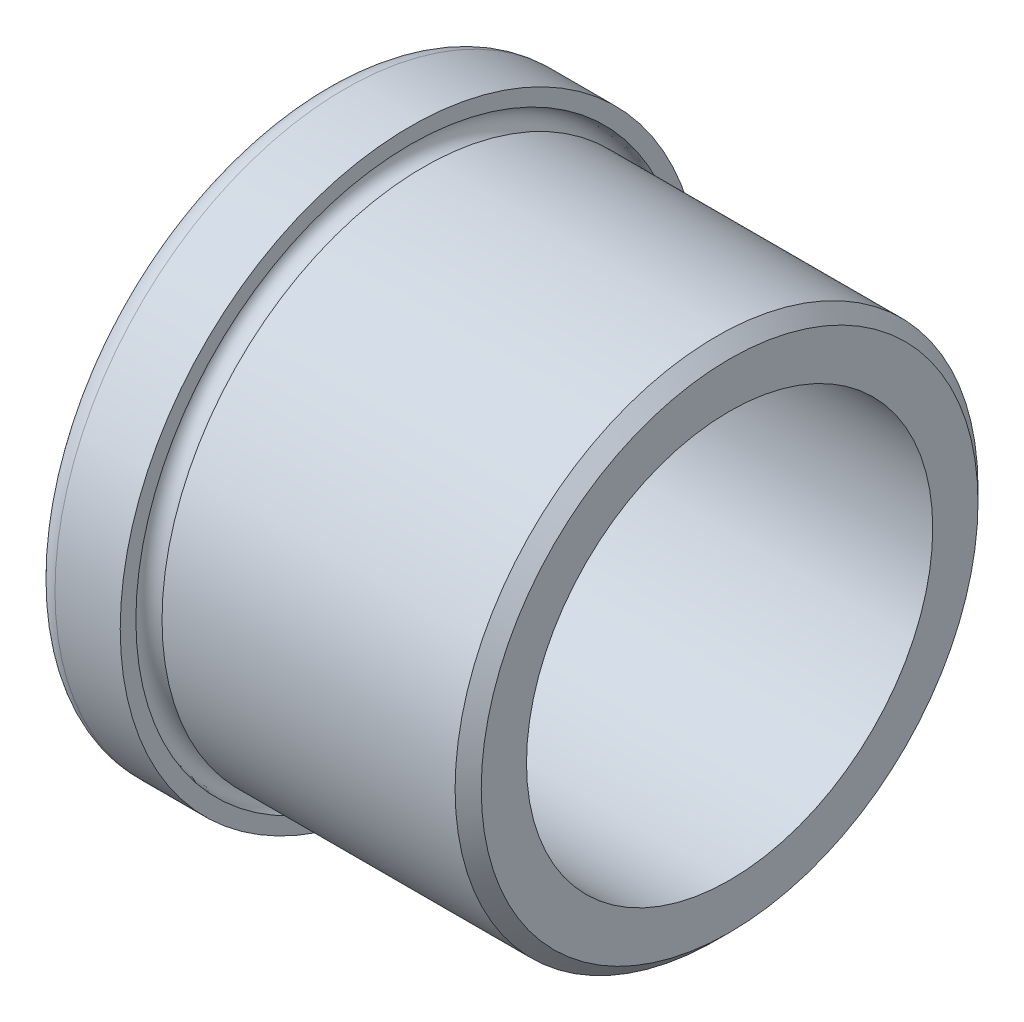
ISO-10303-21;
HEADER;
FILE_DESCRIPTION(('STEP AP214'),'2;1');
FILE_NAME('part.step','',(''),(''),'','','');
FILE_SCHEMA(('AUTOMOTIVE_DESIGN { 1 0 10303 214 1 1 1 1 }'));
ENDSEC;
DATA;
#1=APPLICATION_CONTEXT('core data for automotive mechanical design processes');
#2=APPLICATION_PROTOCOL_DEFINITION('international standard','automotive_design',2000,#1);
#3=PRODUCT_CONTEXT('',#1,'mechanical');
#4=PRODUCT('Part','Part','',(#3));
#5=PRODUCT_RELATED_PRODUCT_CATEGORY('part','',(#4));
#6=PRODUCT_DEFINITION_FORMATION('','',#4);
#7=PRODUCT_DEFINITION_CONTEXT('part definition',#1,'design');
#8=PRODUCT_DEFINITION('design','',#6,#7);
#9=PRODUCT_DEFINITION_SHAPE('','',#8);
#10=(LENGTH_UNIT() NAMED_UNIT(*) SI_UNIT(.MILLI.,.METRE.));
#11=(NAMED_UNIT(*) PLANE_ANGLE_UNIT() SI_UNIT($,.RADIAN.));
#12=(NAMED_UNIT(*) SI_UNIT($,.STERADIAN.) SOLID_ANGLE_UNIT());
#13=UNCERTAINTY_MEASURE_WITH_UNIT(LENGTH_MEASURE(1.E-05),#10,'distance_accuracy_value','');
#14=(GEOMETRIC_REPRESENTATION_CONTEXT(3) GLOBAL_UNCERTAINTY_ASSIGNED_CONTEXT((#13)) GLOBAL_UNIT_ASSIGNED_CONTEXT((#10,
#11,#12)) REPRESENTATION_CONTEXT('',''));
#15=CARTESIAN_POINT('',(0.,0.,0.));
#16=DIRECTION('',(0.,0.,1.));
#17=DIRECTION('',(1.,0.,0.));
#18=AXIS2_PLACEMENT_3D('',#15,#16,#17);
#19=CARTESIAN_POINT('',(9.52499999999999,31.75,0.));
#20=DIRECTION('',(1.,0.,0.));
#21=DIRECTION('',(0.,0.,-1.));
#22=AXIS2_PLACEMENT_3D('',#19,#20,#21);
#23=PLANE('',#22);
#24=CARTESIAN_POINT('',(9.52499999999999,0.,0.));
#25=DIRECTION('',(-1.,0.,0.));
#26=DIRECTION('',(0.,0.,1.));
#27=AXIS2_PLACEMENT_3D('',#24,#25,#26);
#28=CIRCLE('',#27,30.0370875);
#29=CARTESIAN_POINT('',(9.52499999999999,0.,30.0370875));
#30=VERTEX_POINT('',#29);
#31=EDGE_CURVE('E64',#30,#30,#28,.T.);
#32=ORIENTED_EDGE('',*,*,#31,.T.);
#33=EDGE_LOOP('',(#32));
#34=FACE_BOUND('',#33,.T.);
#35=CARTESIAN_POINT('',(9.52499999999999,0.,0.));
#36=DIRECTION('',(-1.,0.,0.));
#37=DIRECTION('',(0.,0.,1.));
#38=AXIS2_PLACEMENT_3D('',#35,#36,#37);
#39=CIRCLE('',#38,31.75);
#40=CARTESIAN_POINT('',(9.52499999999999,0.,31.75));
#41=VERTEX_POINT('',#40);
#42=EDGE_CURVE('E10',#41,#41,#39,.T.);
#43=ORIENTED_EDGE('',*,*,#42,.F.);
#44=EDGE_LOOP('',(#43));
#45=FACE_BOUND('',#44,.T.);
#46=ADVANCED_FACE('F30',(#34,#45),#23,.T.);
#47=CARTESIAN_POINT('',(0.,0.,0.));
#48=DIRECTION('',(-1.,0.,0.));
#49=DIRECTION('',(0.,0.,1.));
#50=AXIS2_PLACEMENT_3D('',#47,#48,#49);
#51=CYLINDRICAL_SURFACE('',#50,31.75);
#52=ORIENTED_EDGE('',*,*,#42,.T.);
#53=EDGE_LOOP('',(#52));
#54=FACE_BOUND('',#53,.T.);
#55=CARTESIAN_POINT('',(2.3876,0.,0.));
#56=DIRECTION('',(-1.,0.,0.));
#57=DIRECTION('',(0.,0.,1.));
#58=AXIS2_PLACEMENT_3D('',#55,#56,#57);
#59=CIRCLE('',#58,31.75);
#60=CARTESIAN_POINT('',(2.3876,0.,31.75));
#61=VERTEX_POINT('',#60);
#62=EDGE_CURVE('E36',#61,#61,#59,.T.);
#63=ORIENTED_EDGE('',*,*,#62,.F.);
#64=EDGE_LOOP('',(#63));
#65=FACE_BOUND('',#64,.T.);
#66=ADVANCED_FACE('F82',(#54,#65),#51,.T.);
#67=CARTESIAN_POINT('',(2.3876,0.,0.));
#68=DIRECTION('',(-1.,0.,0.));
#69=DIRECTION('',(0.,0.,1.));
#70=AXIS2_PLACEMENT_3D('',#67,#68,#69);
#71=TOROIDAL_SURFACE('',#70,29.3624,2.3876);
#72=CARTESIAN_POINT('',(0.,0.,0.));
#73=DIRECTION('',(-1.,0.,0.));
#74=DIRECTION('',(0.,0.,1.));
#75=AXIS2_PLACEMENT_3D('',#72,#73,#74);
#76=CIRCLE('',#75,29.3624);
#77=CARTESIAN_POINT('',(0.,0.,29.3624));
#78=VERTEX_POINT('',#77);
#79=EDGE_CURVE('E40',#78,#78,#76,.T.);
#80=ORIENTED_EDGE('',*,*,#79,.F.);
#81=EDGE_LOOP('',(#80));
#82=FACE_BOUND('',#81,.T.);
#83=ORIENTED_EDGE('',*,*,#62,.T.);
#84=EDGE_LOOP('',(#83));
#85=FACE_BOUND('',#84,.T.);
#86=ADVANCED_FACE('F86',(#82,#85),#71,.T.);
#87=CARTESIAN_POINT('',(0.,24.6126,0.));
#88=DIRECTION('',(-1.,0.,0.));
#89=DIRECTION('',(0.,0.,1.));
#90=AXIS2_PLACEMENT_3D('',#87,#88,#89);
#91=PLANE('',#90);
#92=ORIENTED_EDGE('',*,*,#79,.T.);
#93=EDGE_LOOP('',(#92));
#94=FACE_BOUND('',#93,.T.);
#95=CARTESIAN_POINT('',(0.,0.,0.));
#96=DIRECTION('',(-1.,0.,0.));
#97=DIRECTION('',(0.,0.,1.));
#98=AXIS2_PLACEMENT_3D('',#95,#96,#97);
#99=CIRCLE('',#98,24.6126);
#100=CARTESIAN_POINT('',(0.,0.,24.6126));
#101=VERTEX_POINT('',#100);
#102=EDGE_CURVE('E44',#101,#101,#99,.T.);
#103=ORIENTED_EDGE('',*,*,#102,.F.);
#104=EDGE_LOOP('',(#103));
#105=FACE_BOUND('',#104,.T.);
#106=ADVANCED_FACE('F90',(#94,#105),#91,.T.);
#107=CARTESIAN_POINT('',(2.3876,0.,0.));
#108=DIRECTION('',(-1.,0.,0.));
#109=DIRECTION('',(0.,0.,1.));
#110=AXIS2_PLACEMENT_3D('',#107,#108,#109);
#111=TOROIDAL_SURFACE('',#110,24.6126,2.3876);
#112=CARTESIAN_POINT('',(2.3876,0.,0.));
#113=DIRECTION('',(-1.,0.,0.));
#114=DIRECTION('',(0.,0.,1.));
#115=AXIS2_PLACEMENT_3D('',#112,#113,#114);
#116=CIRCLE('',#115,22.225);
#117=CARTESIAN_POINT('',(2.3876,0.,22.225));
#118=VERTEX_POINT('',#117);
#119=EDGE_CURVE('E49',#118,#118,#116,.T.);
#120=ORIENTED_EDGE('',*,*,#119,.F.);
#121=EDGE_LOOP('',(#120));
#122=FACE_BOUND('',#121,.T.);
#123=ORIENTED_EDGE('',*,*,#102,.T.);
#124=EDGE_LOOP('',(#123));
#125=FACE_BOUND('',#124,.T.);
#126=ADVANCED_FACE('F97',(#122,#125),#111,.T.);
#127=CARTESIAN_POINT('',(0.,0.,0.));
#128=DIRECTION('',(-1.,0.,0.));
#129=DIRECTION('',(0.,0.,1.));
#130=AXIS2_PLACEMENT_3D('',#127,#128,#129);
#131=CYLINDRICAL_SURFACE('',#130,22.225);
#132=ORIENTED_EDGE('',*,*,#119,.T.);
#133=EDGE_LOOP('',(#132));
#134=FACE_BOUND('',#133,.T.);
#135=CARTESIAN_POINT('',(44.4499999999999,0.,0.));
#136=DIRECTION('',(-1.,0.,0.));
#137=DIRECTION('',(0.,0.,1.));
#138=AXIS2_PLACEMENT_3D('',#135,#136,#137);
#139=CIRCLE('',#138,22.225);
#140=CARTESIAN_POINT('',(44.4499999999999,0.,22.225));
#141=VERTEX_POINT('',#140);
#142=EDGE_CURVE('E52',#141,#141,#139,.T.);
#143=ORIENTED_EDGE('',*,*,#142,.F.);
#144=EDGE_LOOP('',(#143));
#145=FACE_BOUND('',#144,.T.);
#146=ADVANCED_FACE('F101',(#134,#145),#131,.F.);
#147=CARTESIAN_POINT('',(44.4499999999999,27.1764125,0.));
#148=DIRECTION('',(1.,0.,0.));
#149=DIRECTION('',(0.,0.,-1.));
#150=AXIS2_PLACEMENT_3D('',#147,#148,#149);
#151=PLANE('',#150);
#152=ORIENTED_EDGE('',*,*,#142,.T.);
#153=EDGE_LOOP('',(#152));
#154=FACE_BOUND('',#153,.T.);
#155=CARTESIAN_POINT('',(44.4499999999999,0.,0.));
#156=DIRECTION('',(-1.,0.,0.));
#157=DIRECTION('',(0.,0.,1.));
#158=AXIS2_PLACEMENT_3D('',#155,#156,#157);
#159=CIRCLE('',#158,27.1764125);
#160=CARTESIAN_POINT('',(44.4499999999999,0.,27.1764125));
#161=VERTEX_POINT('',#160);
#162=EDGE_CURVE('E55',#161,#161,#159,.T.);
#163=ORIENTED_EDGE('',*,*,#162,.F.);
#164=EDGE_LOOP('',(#163));
#165=FACE_BOUND('',#164,.T.);
#166=ADVANCED_FACE('F105',(#154,#165),#151,.T.);
#167=CARTESIAN_POINT('',(43.0196624999999,0.,0.));
#168=DIRECTION('',(-1.,0.,0.));
#169=DIRECTION('',(0.,0.,1.));
#170=AXIS2_PLACEMENT_3D('',#167,#168,#169);
#171=CONICAL_SURFACE('',#170,28.60675,0.785398163397447);
#172=ORIENTED_EDGE('',*,*,#162,.T.);
#173=EDGE_LOOP('',(#172));
#174=FACE_BOUND('',#173,.T.);
#175=CARTESIAN_POINT('',(43.0196624999999,0.,0.));
#176=DIRECTION('',(-1.,0.,0.));
#177=DIRECTION('',(0.,0.,1.));
#178=AXIS2_PLACEMENT_3D('',#175,#176,#177);
#179=CIRCLE('',#178,28.60675);
#180=CARTESIAN_POINT('',(43.0196624999999,0.,28.60675));
#181=VERTEX_POINT('',#180);
#182=EDGE_CURVE('E58',#181,#181,#179,.T.);
#183=ORIENTED_EDGE('',*,*,#182,.F.);
#184=EDGE_LOOP('',(#183));
#185=FACE_BOUND('',#184,.T.);
#186=ADVANCED_FACE('F78',(#174,#185),#171,.T.);
#187=CARTESIAN_POINT('',(0.,0.,0.));
#188=DIRECTION('',(-1.,0.,0.));
#189=DIRECTION('',(0.,0.,1.));
#190=AXIS2_PLACEMENT_3D('',#187,#188,#189);
#191=CYLINDRICAL_SURFACE('',#190,28.60675);
#192=ORIENTED_EDGE('',*,*,#182,.T.);
#193=EDGE_LOOP('',(#192));
#194=FACE_BOUND('',#193,.T.);
#195=CARTESIAN_POINT('',(10.9553375,0.,0.));
#196=DIRECTION('',(-1.,0.,0.));
#197=DIRECTION('',(0.,0.,1.));
#198=AXIS2_PLACEMENT_3D('',#195,#196,#197);
#199=CIRCLE('',#198,28.60675);
#200=CARTESIAN_POINT('',(10.9553375,0.,28.60675));
#201=VERTEX_POINT('',#200);
#202=EDGE_CURVE('E61',#201,#201,#199,.T.);
#203=ORIENTED_EDGE('',*,*,#202,.F.);
#204=EDGE_LOOP('',(#203));
#205=FACE_BOUND('',#204,.T.);
#206=ADVANCED_FACE('F72',(#194,#205),#191,.T.);
#207=CARTESIAN_POINT('',(9.52499999999999,0.,0.));
#208=DIRECTION('',(-1.,0.,0.));
#209=DIRECTION('',(0.,0.,1.));
#210=AXIS2_PLACEMENT_3D('',#207,#208,#209);
#211=TOROIDAL_SURFACE('',#210,28.60675,1.4303375);
#212=ORIENTED_EDGE('',*,*,#202,.T.);
#213=EDGE_LOOP('',(#212));
#214=FACE_BOUND('',#213,.T.);
#215=ORIENTED_EDGE('',*,*,#31,.F.);
#216=EDGE_LOOP('',(#215));
#217=FACE_BOUND('',#216,.T.);
#218=ADVANCED_FACE('F70',(#214,#217),#211,.F.);
#219=CLOSED_SHELL('',(#46,#66,#86,#106,#126,#146,#166,#186,#206,#218));
#220=MANIFOLD_SOLID_BREP('B2',#219);
#221=ADVANCED_BREP_SHAPE_REPRESENTATION('',(#18,#220),#14);
#222=SHAPE_DEFINITION_REPRESENTATION(#9,#221);
ENDSEC;
END-ISO-10303-21;
